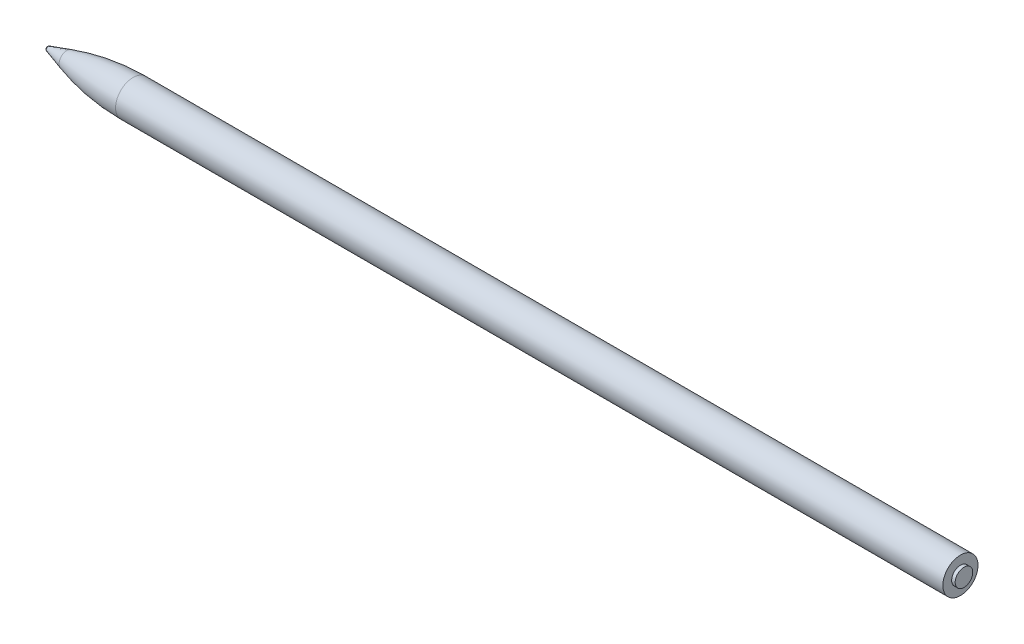
ISO-10303-21;
HEADER;
FILE_DESCRIPTION(('STEP AP214'),'2;1');
FILE_NAME('part.step','',(''),(''),'','','');
FILE_SCHEMA(('AUTOMOTIVE_DESIGN { 1 0 10303 214 1 1 1 1 }'));
ENDSEC;
DATA;
#1=APPLICATION_CONTEXT('core data for automotive mechanical design processes');
#2=APPLICATION_PROTOCOL_DEFINITION('international standard','automotive_design',2000,#1);
#3=PRODUCT_CONTEXT('',#1,'mechanical');
#4=PRODUCT('Part','Part','',(#3));
#5=PRODUCT_RELATED_PRODUCT_CATEGORY('part','',(#4));
#6=PRODUCT_DEFINITION_FORMATION('','',#4);
#7=PRODUCT_DEFINITION_CONTEXT('part definition',#1,'design');
#8=PRODUCT_DEFINITION('design','',#6,#7);
#9=PRODUCT_DEFINITION_SHAPE('','',#8);
#10=(LENGTH_UNIT() NAMED_UNIT(*) SI_UNIT(.MILLI.,.METRE.));
#11=(NAMED_UNIT(*) PLANE_ANGLE_UNIT() SI_UNIT($,.RADIAN.));
#12=(NAMED_UNIT(*) SI_UNIT($,.STERADIAN.) SOLID_ANGLE_UNIT());
#13=UNCERTAINTY_MEASURE_WITH_UNIT(LENGTH_MEASURE(1.E-05),#10,'distance_accuracy_value','');
#14=(GEOMETRIC_REPRESENTATION_CONTEXT(3) GLOBAL_UNCERTAINTY_ASSIGNED_CONTEXT((#13)) GLOBAL_UNIT_ASSIGNED_CONTEXT((#10,
#11,#12)) REPRESENTATION_CONTEXT('',''));
#15=CARTESIAN_POINT('',(0.,0.,0.));
#16=DIRECTION('',(0.,0.,1.));
#17=DIRECTION('',(1.,0.,0.));
#18=AXIS2_PLACEMENT_3D('',#15,#16,#17);
#19=CARTESIAN_POINT('',(0.,0.,0.));
#20=DIRECTION('',(1.,0.,0.));
#21=DIRECTION('',(0.,1.,0.));
#22=AXIS2_PLACEMENT_3D('',#19,#20,#21);
#23=PLANE('',#22);
#24=CARTESIAN_POINT('',(0.,0.,0.));
#25=DIRECTION('',(1.,0.,0.));
#26=DIRECTION('',(0.,1.,0.));
#27=AXIS2_PLACEMENT_3D('',#24,#25,#26);
#28=CIRCLE('',#27,0.5);
#29=CARTESIAN_POINT('',(0.,0.5,0.));
#30=VERTEX_POINT('',#29);
#31=EDGE_CURVE('E10',#30,#30,#28,.T.);
#32=ORIENTED_EDGE('',*,*,#31,.T.);
#33=EDGE_LOOP('',(#32));
#34=FACE_BOUND('',#33,.T.);
#35=ADVANCED_FACE('F35',(#34),#23,.T.);
#36=CARTESIAN_POINT('',(0.,0.,0.));
#37=DIRECTION('',(1.,0.,0.));
#38=DIRECTION('',(0.,1.,0.));
#39=AXIS2_PLACEMENT_3D('',#36,#37,#38);
#40=CYLINDRICAL_SURFACE('',#39,0.5);
#41=CARTESIAN_POINT('',(-0.2,0.,0.));
#42=DIRECTION('',(1.,0.,0.));
#43=DIRECTION('',(0.,1.,0.));
#44=AXIS2_PLACEMENT_3D('',#41,#42,#43);
#45=CIRCLE('',#44,0.5);
#46=CARTESIAN_POINT('',(-0.200000000000001,0.5,0.));
#47=VERTEX_POINT('',#46);
#48=EDGE_CURVE('E41',#47,#47,#45,.T.);
#49=ORIENTED_EDGE('',*,*,#48,.T.);
#50=EDGE_LOOP('',(#49));
#51=FACE_BOUND('',#50,.T.);
#52=ORIENTED_EDGE('',*,*,#31,.F.);
#53=EDGE_LOOP('',(#52));
#54=FACE_BOUND('',#53,.T.);
#55=ADVANCED_FACE('F73',(#51,#54),#40,.T.);
#56=CARTESIAN_POINT('',(-0.200000000000001,0.5,0.));
#57=DIRECTION('',(1.,0.,0.));
#58=DIRECTION('',(0.,1.,0.));
#59=AXIS2_PLACEMENT_3D('',#56,#57,#58);
#60=PLANE('',#59);
#61=CARTESIAN_POINT('',(-0.2,0.,0.));
#62=DIRECTION('',(1.,0.,0.));
#63=DIRECTION('',(0.,1.,0.));
#64=AXIS2_PLACEMENT_3D('',#61,#62,#63);
#65=CIRCLE('',#64,0.999999999999994);
#66=CARTESIAN_POINT('',(-0.200000000000001,0.999999999999994,0.));
#67=VERTEX_POINT('',#66);
#68=EDGE_CURVE('E45',#67,#67,#65,.T.);
#69=ORIENTED_EDGE('',*,*,#68,.T.);
#70=EDGE_LOOP('',(#69));
#71=FACE_BOUND('',#70,.T.);
#72=ORIENTED_EDGE('',*,*,#48,.F.);
#73=EDGE_LOOP('',(#72));
#74=FACE_BOUND('',#73,.T.);
#75=ADVANCED_FACE('F77',(#71,#74),#60,.T.);
#76=CARTESIAN_POINT('',(0.,0.,0.));
#77=DIRECTION('',(1.,0.,0.));
#78=DIRECTION('',(0.,1.,0.));
#79=AXIS2_PLACEMENT_3D('',#76,#77,#78);
#80=CYLINDRICAL_SURFACE('',#79,0.999999999999997);
#81=CARTESIAN_POINT('',(-47.2936936894518,0.,0.));
#82=DIRECTION('',(1.,0.,0.));
#83=DIRECTION('',(0.,1.,0.));
#84=AXIS2_PLACEMENT_3D('',#81,#82,#83);
#85=CIRCLE('',#84,1.);
#86=CARTESIAN_POINT('',(-47.2936936894518,0.999999999999994,0.));
#87=VERTEX_POINT('',#86);
#88=EDGE_CURVE('E49',#87,#87,#85,.T.);
#89=ORIENTED_EDGE('',*,*,#88,.T.);
#90=EDGE_LOOP('',(#89));
#91=FACE_BOUND('',#90,.T.);
#92=ORIENTED_EDGE('',*,*,#68,.F.);
#93=EDGE_LOOP('',(#92));
#94=FACE_BOUND('',#93,.T.);
#95=ADVANCED_FACE('F81',(#91,#94),#80,.T.);
#96=CARTESIAN_POINT('',(-47.2936936894518,0.,0.));
#97=DIRECTION('',(1.,0.,0.));
#98=DIRECTION('',(0.,1.,0.));
#99=AXIS2_PLACEMENT_3D('',#96,#97,#98);
#100=DEGENERATE_TOROIDAL_SURFACE('',#99,12.,13.,.F.);
#101=CARTESIAN_POINT('',(-51.07,0.,0.));
#102=DIRECTION('',(1.,0.,0.));
#103=DIRECTION('',(0.,1.,0.));
#104=AXIS2_PLACEMENT_3D('',#101,#102,#103);
#105=CIRCLE('',#104,0.439433694863861);
#106=CARTESIAN_POINT('',(-51.07,0.439433694863854,0.));
#107=VERTEX_POINT('',#106);
#108=EDGE_CURVE('E54',#107,#107,#105,.T.);
#109=ORIENTED_EDGE('',*,*,#108,.T.);
#110=EDGE_LOOP('',(#109));
#111=FACE_BOUND('',#110,.T.);
#112=ORIENTED_EDGE('',*,*,#88,.F.);
#113=EDGE_LOOP('',(#112));
#114=FACE_BOUND('',#113,.T.);
#115=ADVANCED_FACE('F70',(#111,#114),#100,.F.);
#116=CARTESIAN_POINT('',(-51.07,0.,0.));
#117=DIRECTION('',(1.,0.,0.));
#118=DIRECTION('',(0.,1.,0.));
#119=AXIS2_PLACEMENT_3D('',#116,#117,#118);
#120=CONICAL_SURFACE('',#119,0.439433694863861,0.294733759991085);
#121=CARTESIAN_POINT('',(-52.1077630631055,0.,0.));
#122=DIRECTION('',(1.,0.,0.));
#123=DIRECTION('',(0.,1.,0.));
#124=AXIS2_PLACEMENT_3D('',#121,#122,#123);
#125=CIRCLE('',#124,0.124394336948638);
#126=CARTESIAN_POINT('',(-52.1077630631055,0.12439433694863,0.));
#127=VERTEX_POINT('',#126);
#128=EDGE_CURVE('E57',#127,#127,#125,.T.);
#129=CARTESIAN_POINT('',(-52.1077630631055,0.12439433694863,0.));
#130=CARTESIAN_POINT('',(-52.0969530311981,0.127675996926914,0.));
#131=CARTESIAN_POINT('',(-52.0861429992908,0.130957656905198,0.));
#132=CARTESIAN_POINT('',(-52.0645229354761,0.137520976861765,0.));
#133=CARTESIAN_POINT('',(-52.0537129035688,0.140802636840048,0.));
#134=CARTESIAN_POINT('',(-52.032092839754,0.147365956796616,0.));
#135=CARTESIAN_POINT('',(-52.0212828078467,0.150647616774899,0.));
#136=CARTESIAN_POINT('',(-51.999662744032,0.157210936731466,0.));
#137=CARTESIAN_POINT('',(-51.9888527121247,0.160492596709749,0.));
#138=CARTESIAN_POINT('',(-51.96723264831,0.167055916666317,0.));
#139=CARTESIAN_POINT('',(-51.9564226164026,0.170337576644601,0.));
#140=CARTESIAN_POINT('',(-51.9348025525879,0.176900896601168,0.));
#141=CARTESIAN_POINT('',(-51.9239925206806,0.180182556579452,0.));
#142=CARTESIAN_POINT('',(-51.9023724568659,0.186745876536018,0.));
#143=CARTESIAN_POINT('',(-51.8915624249585,0.190027536514302,0.));
#144=CARTESIAN_POINT('',(-51.8699423611438,0.196590856470869,0.));
#145=CARTESIAN_POINT('',(-51.8591323292365,0.199872516449153,0.));
#146=CARTESIAN_POINT('',(-51.8375122654218,0.20643583640572,0.));
#147=CARTESIAN_POINT('',(-51.8267022335144,0.209717496384004,0.));
#148=CARTESIAN_POINT('',(-51.8050821696997,0.216280816340571,0.));
#149=CARTESIAN_POINT('',(-51.7942721377924,0.219562476318854,0.));
#150=CARTESIAN_POINT('',(-51.7726520739777,0.226125796275422,0.));
#151=CARTESIAN_POINT('',(-51.7618420420703,0.229407456253705,0.));
#152=CARTESIAN_POINT('',(-51.7402219782556,0.235970776210272,0.));
#153=CARTESIAN_POINT('',(-51.7294119463483,0.239252436188555,0.));
#154=CARTESIAN_POINT('',(-51.7077918825336,0.245815756145123,0.));
#155=CARTESIAN_POINT('',(-51.6969818506262,0.249097416123407,0.));
#156=CARTESIAN_POINT('',(-51.6753617868115,0.255660736079974,0.));
#157=CARTESIAN_POINT('',(-51.6645517549042,0.258942396058257,0.));
#158=CARTESIAN_POINT('',(-51.6429316910895,0.265505716014824,0.));
#159=CARTESIAN_POINT('',(-51.6321216591821,0.268787375993108,0.));
#160=CARTESIAN_POINT('',(-51.6105015953674,0.275350695949675,0.));
#161=CARTESIAN_POINT('',(-51.5996915634601,0.278632355927959,0.));
#162=CARTESIAN_POINT('',(-51.5780714996454,0.285195675884526,0.));
#163=CARTESIAN_POINT('',(-51.567261467738,0.28847733586281,0.));
#164=CARTESIAN_POINT('',(-51.5456414039233,0.295040655819376,0.));
#165=CARTESIAN_POINT('',(-51.534831372016,0.29832231579766,0.));
#166=CARTESIAN_POINT('',(-51.5132113082013,0.304885635754227,0.));
#167=CARTESIAN_POINT('',(-51.502401276294,0.308167295732511,0.));
#168=CARTESIAN_POINT('',(-51.4807812124793,0.314730615689078,0.));
#169=CARTESIAN_POINT('',(-51.4699711805719,0.318012275667361,0.));
#170=CARTESIAN_POINT('',(-51.4483511167572,0.324575595623929,0.));
#171=CARTESIAN_POINT('',(-51.4375410848499,0.327857255602213,0.));
#172=CARTESIAN_POINT('',(-51.4159210210352,0.33442057555878,0.));
#173=CARTESIAN_POINT('',(-51.4051109891278,0.337702235537063,0.));
#174=CARTESIAN_POINT('',(-51.3834909253131,0.34426555549363,0.));
#175=CARTESIAN_POINT('',(-51.3726808934058,0.347547215471913,0.));
#176=CARTESIAN_POINT('',(-51.3510608295911,0.354110535428481,0.));
#177=CARTESIAN_POINT('',(-51.3402507976837,0.357392195406765,0.));
#178=CARTESIAN_POINT('',(-51.318630733869,0.363955515363332,0.));
#179=CARTESIAN_POINT('',(-51.3078207019617,0.367237175341615,0.));
#180=CARTESIAN_POINT('',(-51.286200638147,0.373800495298182,0.));
#181=CARTESIAN_POINT('',(-51.2753906062396,0.377082155276466,0.));
#182=CARTESIAN_POINT('',(-51.2537705424249,0.383645475233033,0.));
#183=CARTESIAN_POINT('',(-51.2429605105176,0.386927135211317,0.));
#184=CARTESIAN_POINT('',(-51.2213404467029,0.393490455167884,0.));
#185=CARTESIAN_POINT('',(-51.2105304147955,0.396772115146167,0.));
#186=CARTESIAN_POINT('',(-51.1889103509808,0.403335435102735,0.));
#187=CARTESIAN_POINT('',(-51.1781003190735,0.406617095081019,0.));
#188=CARTESIAN_POINT('',(-51.1564802552588,0.413180415037586,0.));
#189=CARTESIAN_POINT('',(-51.1456702233514,0.416462075015869,0.));
#190=CARTESIAN_POINT('',(-51.1240501595367,0.423025394972436,0.));
#191=CARTESIAN_POINT('',(-51.1132401276294,0.42630705495072,0.));
#192=CARTESIAN_POINT('',(-51.0916200638147,0.432870374907287,0.));
#193=CARTESIAN_POINT('',(-51.0808100319073,0.43615203488557,0.));
#194=CARTESIAN_POINT('',(-51.07,0.439433694863854,0.));
#195=B_SPLINE_CURVE_WITH_KNOTS('',3,(#129,#130,#131,#132,#133,#134,#135,#136,#137,#138,#139,
#140,#141,#142,#143,#144,#145,#146,#147,#148,#149,#150,#151,#152,#153,#154,#155,#156,#157,#158,
#159,#160,#161,#162,#163,#164,#165,#166,#167,#168,#169,#170,#171,#172,#173,#174,#175,#176,#177,
#178,#179,#180,#181,#182,#183,#184,#185,#186,#187,#188,#189,#190,#191,#192,#193,#194),
.UNSPECIFIED.,.F.,.F.,(4,2,2,2,2,2,2,2,2,2,2,2,2,2,2,2,2,2,2,2,2,2,2,2,2,2,2,2,2,2,2,2,4),(0.,
0.0338915142544388,0.0677830285088776,0.101674542763316,0.135566057017755,0.169457571272187,
0.203349085526626,0.237240599781065,0.271132114035497,0.305023628289936,0.338915142544375,
0.372806656798814,0.406698171053253,0.440589685307685,0.474481199562123,0.508372713816562,
0.542264228070995,0.576155742325433,0.610047256579872,0.643938770834311,0.67783028508875,
0.711721799343182,0.745613313597621,0.77950482785206,0.813396342106492,0.847287856360931,
0.881179370615369,0.915070884869808,0.948962399124247,0.982853913378679,1.01674542763312,
1.05063694188756,1.08452845614199),.UNSPECIFIED.);
#196=EDGE_CURVE('BSEAM61',#127,#107,#195,.T.);
#197=ORIENTED_EDGE('',*,*,#128,.T.);
#198=ORIENTED_EDGE('',*,*,#108,.F.);
#199=ORIENTED_EDGE('',*,*,#196,.T.);
#200=ORIENTED_EDGE('',*,*,#196,.F.);
#201=EDGE_LOOP('',(#197,#199,#198,#200));
#202=FACE_BOUND('',#201,.T.);
#203=ADVANCED_FACE('F61',(#202),#120,.T.);
#204=CARTESIAN_POINT('',(-52.07,0.,0.));
#205=DIRECTION('',(1.,0.,0.));
#206=DIRECTION('',(0.,1.,0.));
#207=AXIS2_PLACEMENT_3D('',#204,#205,#206);
#208=SPHERICAL_SURFACE('',#207,0.129999999999999);
#209=ORIENTED_EDGE('',*,*,#128,.F.);
#210=EDGE_LOOP('',(#209));
#211=FACE_BOUND('',#210,.T.);
#212=ADVANCED_FACE('F64',(#211),#208,.T.);
#213=CLOSED_SHELL('',(#35,#55,#75,#95,#115,#203,#212));
#214=MANIFOLD_SOLID_BREP('B2',#213);
#215=ADVANCED_BREP_SHAPE_REPRESENTATION('',(#18,#214),#14);
#216=SHAPE_DEFINITION_REPRESENTATION(#9,#215);
ENDSEC;
END-ISO-10303-21;
